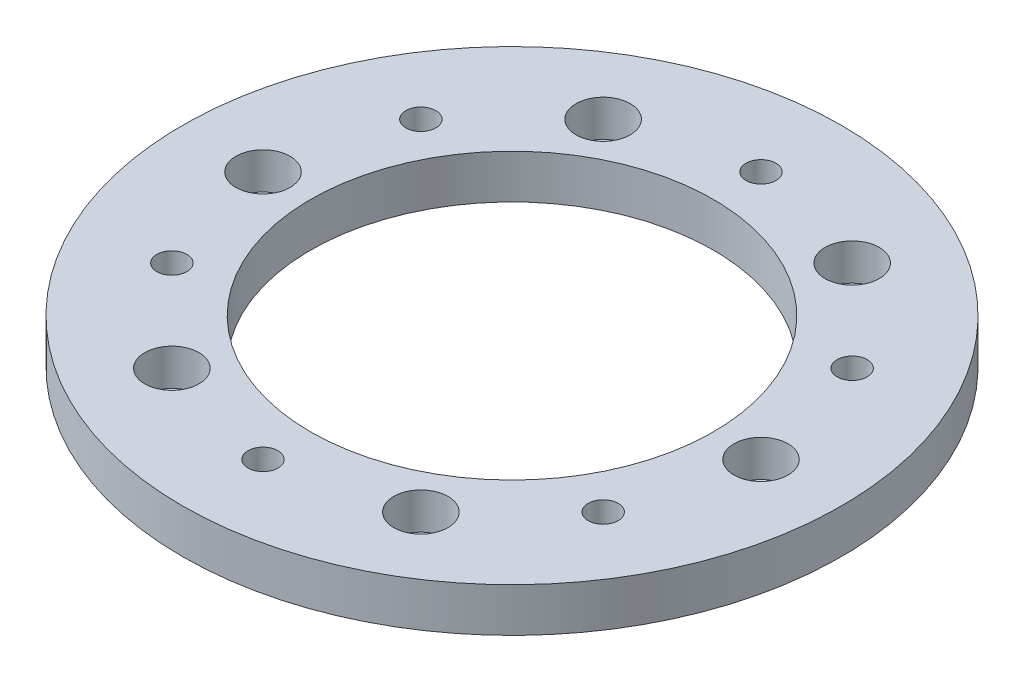
ISO-10303-21;
HEADER;
FILE_DESCRIPTION(('STEP AP214'),'2;1');
FILE_NAME('part.step','',(''),(''),'','','');
FILE_SCHEMA(('AUTOMOTIVE_DESIGN { 1 0 10303 214 1 1 1 1 }'));
ENDSEC;
DATA;
#1=APPLICATION_CONTEXT('core data for automotive mechanical design processes');
#2=APPLICATION_PROTOCOL_DEFINITION('international standard','automotive_design',2000,#1);
#3=PRODUCT_CONTEXT('',#1,'mechanical');
#4=PRODUCT('Part','Part','',(#3));
#5=PRODUCT_RELATED_PRODUCT_CATEGORY('part','',(#4));
#6=PRODUCT_DEFINITION_FORMATION('','',#4);
#7=PRODUCT_DEFINITION_CONTEXT('part definition',#1,'design');
#8=PRODUCT_DEFINITION('design','',#6,#7);
#9=PRODUCT_DEFINITION_SHAPE('','',#8);
#10=(LENGTH_UNIT() NAMED_UNIT(*) SI_UNIT(.MILLI.,.METRE.));
#11=(NAMED_UNIT(*) PLANE_ANGLE_UNIT() SI_UNIT($,.RADIAN.));
#12=(NAMED_UNIT(*) SI_UNIT($,.STERADIAN.) SOLID_ANGLE_UNIT());
#13=UNCERTAINTY_MEASURE_WITH_UNIT(LENGTH_MEASURE(1.E-05),#10,'distance_accuracy_value','');
#14=(GEOMETRIC_REPRESENTATION_CONTEXT(3) GLOBAL_UNCERTAINTY_ASSIGNED_CONTEXT((#13)) GLOBAL_UNIT_ASSIGNED_CONTEXT((#10,
#11,#12)) REPRESENTATION_CONTEXT('',''));
#15=CARTESIAN_POINT('',(0.,0.,0.));
#16=DIRECTION('',(0.,0.,1.));
#17=DIRECTION('',(1.,0.,0.));
#18=AXIS2_PLACEMENT_3D('',#15,#16,#17);
#19=CARTESIAN_POINT('',(34.,6.,0.));
#20=DIRECTION('',(0.,-1.,0.));
#21=DIRECTION('',(0.,0.,-1.));
#22=AXIS2_PLACEMENT_3D('',#19,#20,#21);
#23=CYLINDRICAL_SURFACE('',#22,2.04999999999999);
#24=CARTESIAN_POINT('',(34.,0.,0.));
#25=DIRECTION('',(0.,1.,0.));
#26=DIRECTION('',(0.,0.,1.));
#27=AXIS2_PLACEMENT_3D('',#24,#25,#26);
#28=CIRCLE('',#27,2.04999999999999);
#29=CARTESIAN_POINT('',(34.,0.,2.04999999999999));
#30=VERTEX_POINT('',#29);
#31=EDGE_CURVE('E54',#30,#30,#28,.T.);
#32=ORIENTED_EDGE('',*,*,#31,.F.);
#33=EDGE_LOOP('',(#32));
#34=FACE_BOUND('',#33,.T.);
#35=CARTESIAN_POINT('',(34.,1.,0.));
#36=DIRECTION('',(0.,1.,0.));
#37=DIRECTION('',(0.,0.,1.));
#38=AXIS2_PLACEMENT_3D('',#35,#36,#37);
#39=CIRCLE('',#38,2.04999999999999);
#40=CARTESIAN_POINT('',(34.,1.,2.04999999999999));
#41=VERTEX_POINT('',#40);
#42=EDGE_CURVE('E45',#41,#41,#39,.T.);
#43=ORIENTED_EDGE('',*,*,#42,.T.);
#44=EDGE_LOOP('',(#43));
#45=FACE_BOUND('',#44,.T.);
#46=ADVANCED_FACE('F41',(#34,#45),#23,.F.);
#47=CARTESIAN_POINT('',(17.,6.,29.4448637286709));
#48=DIRECTION('',(0.,-1.,0.));
#49=DIRECTION('',(0.,0.,-1.));
#50=AXIS2_PLACEMENT_3D('',#47,#48,#49);
#51=CYLINDRICAL_SURFACE('',#50,2.05);
#52=CARTESIAN_POINT('',(17.,0.,29.4448637286709));
#53=DIRECTION('',(0.,1.,0.));
#54=DIRECTION('',(0.,0.,1.));
#55=AXIS2_PLACEMENT_3D('',#52,#53,#54);
#56=CIRCLE('',#55,2.05);
#57=CARTESIAN_POINT('',(17.,0.,31.4948637286709));
#58=VERTEX_POINT('',#57);
#59=EDGE_CURVE('E122',#58,#58,#56,.T.);
#60=ORIENTED_EDGE('',*,*,#59,.F.);
#61=EDGE_LOOP('',(#60));
#62=FACE_BOUND('',#61,.T.);
#63=CARTESIAN_POINT('',(17.,1.,29.4448637286709));
#64=DIRECTION('',(0.,1.,0.));
#65=DIRECTION('',(0.,0.,1.));
#66=AXIS2_PLACEMENT_3D('',#63,#64,#65);
#67=CIRCLE('',#66,2.05);
#68=CARTESIAN_POINT('',(17.,1.,31.4948637286709));
#69=VERTEX_POINT('',#68);
#70=EDGE_CURVE('E71',#69,#69,#67,.T.);
#71=ORIENTED_EDGE('',*,*,#70,.T.);
#72=EDGE_LOOP('',(#71));
#73=FACE_BOUND('',#72,.T.);
#74=ADVANCED_FACE('F157',(#62,#73),#51,.F.);
#75=CARTESIAN_POINT('',(-17.,6.,29.4448637286709));
#76=DIRECTION('',(0.,-1.,0.));
#77=DIRECTION('',(0.,0.,-1.));
#78=AXIS2_PLACEMENT_3D('',#75,#76,#77);
#79=CYLINDRICAL_SURFACE('',#78,2.05);
#80=CARTESIAN_POINT('',(-17.,0.,29.4448637286709));
#81=DIRECTION('',(0.,1.,0.));
#82=DIRECTION('',(0.,0.,1.));
#83=AXIS2_PLACEMENT_3D('',#80,#81,#82);
#84=CIRCLE('',#83,2.05);
#85=CARTESIAN_POINT('',(-17.,0.,31.4948637286709));
#86=VERTEX_POINT('',#85);
#87=EDGE_CURVE('E113',#86,#86,#84,.T.);
#88=ORIENTED_EDGE('',*,*,#87,.F.);
#89=EDGE_LOOP('',(#88));
#90=FACE_BOUND('',#89,.T.);
#91=CARTESIAN_POINT('',(-17.,1.,29.4448637286709));
#92=DIRECTION('',(0.,1.,0.));
#93=DIRECTION('',(0.,0.,1.));
#94=AXIS2_PLACEMENT_3D('',#91,#92,#93);
#95=CIRCLE('',#94,2.05);
#96=CARTESIAN_POINT('',(-17.,1.,31.4948637286709));
#97=VERTEX_POINT('',#96);
#98=EDGE_CURVE('E69',#97,#97,#95,.T.);
#99=ORIENTED_EDGE('',*,*,#98,.T.);
#100=EDGE_LOOP('',(#99));
#101=FACE_BOUND('',#100,.T.);
#102=ADVANCED_FACE('F162',(#90,#101),#79,.F.);
#103=CARTESIAN_POINT('',(-34.,6.,0.));
#104=DIRECTION('',(0.,-1.,0.));
#105=DIRECTION('',(0.,0.,-1.));
#106=AXIS2_PLACEMENT_3D('',#103,#104,#105);
#107=CYLINDRICAL_SURFACE('',#106,2.04999999999999);
#108=CARTESIAN_POINT('',(-34.,0.,0.));
#109=DIRECTION('',(0.,1.,0.));
#110=DIRECTION('',(0.,0.,1.));
#111=AXIS2_PLACEMENT_3D('',#108,#109,#110);
#112=CIRCLE('',#111,2.04999999999999);
#113=CARTESIAN_POINT('',(-34.,0.,2.05));
#114=VERTEX_POINT('',#113);
#115=EDGE_CURVE('E104',#114,#114,#112,.T.);
#116=ORIENTED_EDGE('',*,*,#115,.F.);
#117=EDGE_LOOP('',(#116));
#118=FACE_BOUND('',#117,.T.);
#119=CARTESIAN_POINT('',(-34.,1.,0.));
#120=DIRECTION('',(0.,1.,0.));
#121=DIRECTION('',(0.,0.,1.));
#122=AXIS2_PLACEMENT_3D('',#119,#120,#121);
#123=CIRCLE('',#122,2.04999999999999);
#124=CARTESIAN_POINT('',(-34.,1.,2.05));
#125=VERTEX_POINT('',#124);
#126=EDGE_CURVE('E66',#125,#125,#123,.T.);
#127=ORIENTED_EDGE('',*,*,#126,.T.);
#128=EDGE_LOOP('',(#127));
#129=FACE_BOUND('',#128,.T.);
#130=ADVANCED_FACE('F276',(#118,#129),#107,.F.);
#131=CARTESIAN_POINT('',(-17.,6.,-29.4448637286709));
#132=DIRECTION('',(0.,-1.,0.));
#133=DIRECTION('',(0.,0.,-1.));
#134=AXIS2_PLACEMENT_3D('',#131,#132,#133);
#135=CYLINDRICAL_SURFACE('',#134,2.04999999999999);
#136=CARTESIAN_POINT('',(-17.,0.,-29.4448637286709));
#137=DIRECTION('',(0.,1.,0.));
#138=DIRECTION('',(0.,0.,1.));
#139=AXIS2_PLACEMENT_3D('',#136,#137,#138);
#140=CIRCLE('',#139,2.04999999999999);
#141=CARTESIAN_POINT('',(-17.,0.,-27.3948637286709));
#142=VERTEX_POINT('',#141);
#143=EDGE_CURVE('E95',#142,#142,#140,.T.);
#144=ORIENTED_EDGE('',*,*,#143,.F.);
#145=EDGE_LOOP('',(#144));
#146=FACE_BOUND('',#145,.T.);
#147=CARTESIAN_POINT('',(-17.,1.,-29.4448637286709));
#148=DIRECTION('',(0.,1.,0.));
#149=DIRECTION('',(0.,0.,1.));
#150=AXIS2_PLACEMENT_3D('',#147,#148,#149);
#151=CIRCLE('',#150,2.04999999999999);
#152=CARTESIAN_POINT('',(-17.,1.,-27.3948637286709));
#153=VERTEX_POINT('',#152);
#154=EDGE_CURVE('E62',#153,#153,#151,.T.);
#155=ORIENTED_EDGE('',*,*,#154,.T.);
#156=EDGE_LOOP('',(#155));
#157=FACE_BOUND('',#156,.T.);
#158=ADVANCED_FACE('F286',(#146,#157),#135,.F.);
#159=CARTESIAN_POINT('',(17.,6.,-29.4448637286709));
#160=DIRECTION('',(0.,-1.,0.));
#161=DIRECTION('',(0.,0.,-1.));
#162=AXIS2_PLACEMENT_3D('',#159,#160,#161);
#163=CYLINDRICAL_SURFACE('',#162,2.04999999999999);
#164=CARTESIAN_POINT('',(17.,0.,-29.4448637286709));
#165=DIRECTION('',(0.,1.,0.));
#166=DIRECTION('',(0.,0.,1.));
#167=AXIS2_PLACEMENT_3D('',#164,#165,#166);
#168=CIRCLE('',#167,2.04999999999999);
#169=CARTESIAN_POINT('',(17.,0.,-27.3948637286709));
#170=VERTEX_POINT('',#169);
#171=EDGE_CURVE('E85',#170,#170,#168,.T.);
#172=ORIENTED_EDGE('',*,*,#171,.F.);
#173=EDGE_LOOP('',(#172));
#174=FACE_BOUND('',#173,.T.);
#175=CARTESIAN_POINT('',(17.,1.,-29.4448637286709));
#176=DIRECTION('',(0.,1.,0.));
#177=DIRECTION('',(0.,0.,1.));
#178=AXIS2_PLACEMENT_3D('',#175,#176,#177);
#179=CIRCLE('',#178,2.04999999999999);
#180=CARTESIAN_POINT('',(17.,1.,-27.3948637286709));
#181=VERTEX_POINT('',#180);
#182=EDGE_CURVE('E59',#181,#181,#179,.T.);
#183=ORIENTED_EDGE('',*,*,#182,.T.);
#184=EDGE_LOOP('',(#183));
#185=FACE_BOUND('',#184,.T.);
#186=ADVANCED_FACE('F169',(#174,#185),#163,.F.);
#187=CARTESIAN_POINT('',(0.,6.,0.));
#188=DIRECTION('',(0.,1.,0.));
#189=DIRECTION('',(0.,0.,1.));
#190=AXIS2_PLACEMENT_3D('',#187,#188,#189);
#191=PLANE('',#190);
#192=CARTESIAN_POINT('',(34.,6.,0.));
#193=DIRECTION('',(0.,1.,0.));
#194=DIRECTION('',(0.,0.,1.));
#195=AXIS2_PLACEMENT_3D('',#192,#193,#194);
#196=CIRCLE('',#195,3.7);
#197=CARTESIAN_POINT('',(34.,6.,3.7));
#198=VERTEX_POINT('',#197);
#199=EDGE_CURVE('E456',#198,#198,#196,.T.);
#200=ORIENTED_EDGE('',*,*,#199,.F.);
#201=EDGE_LOOP('',(#200));
#202=FACE_BOUND('',#201,.T.);
#203=CARTESIAN_POINT('',(17.,6.,-29.4448637286709));
#204=DIRECTION('',(0.,1.,0.));
#205=DIRECTION('',(0.,0.,1.));
#206=AXIS2_PLACEMENT_3D('',#203,#204,#205);
#207=CIRCLE('',#206,3.7);
#208=CARTESIAN_POINT('',(17.,6.,-25.7448637286709));
#209=VERTEX_POINT('',#208);
#210=EDGE_CURVE('E462',#209,#209,#207,.T.);
#211=ORIENTED_EDGE('',*,*,#210,.F.);
#212=EDGE_LOOP('',(#211));
#213=FACE_BOUND('',#212,.T.);
#214=CARTESIAN_POINT('',(-17.,6.,-29.4448637286709));
#215=DIRECTION('',(0.,1.,0.));
#216=DIRECTION('',(0.,0.,1.));
#217=AXIS2_PLACEMENT_3D('',#214,#215,#216);
#218=CIRCLE('',#217,3.70000000000001);
#219=CARTESIAN_POINT('',(-17.,6.,-25.7448637286709));
#220=VERTEX_POINT('',#219);
#221=EDGE_CURVE('E486',#220,#220,#218,.T.);
#222=ORIENTED_EDGE('',*,*,#221,.F.);
#223=EDGE_LOOP('',(#222));
#224=FACE_BOUND('',#223,.T.);
#225=CARTESIAN_POINT('',(-34.,6.,0.));
#226=DIRECTION('',(0.,1.,0.));
#227=DIRECTION('',(0.,0.,1.));
#228=AXIS2_PLACEMENT_3D('',#225,#226,#227);
#229=CIRCLE('',#228,3.7);
#230=CARTESIAN_POINT('',(-34.,6.,3.70000000000001));
#231=VERTEX_POINT('',#230);
#232=EDGE_CURVE('E480',#231,#231,#229,.T.);
#233=ORIENTED_EDGE('',*,*,#232,.F.);
#234=EDGE_LOOP('',(#233));
#235=FACE_BOUND('',#234,.T.);
#236=CARTESIAN_POINT('',(-17.,6.,29.4448637286709));
#237=DIRECTION('',(0.,1.,0.));
#238=DIRECTION('',(0.,0.,1.));
#239=AXIS2_PLACEMENT_3D('',#236,#237,#238);
#240=CIRCLE('',#239,3.7);
#241=CARTESIAN_POINT('',(-17.,6.,33.1448637286709));
#242=VERTEX_POINT('',#241);
#243=EDGE_CURVE('E474',#242,#242,#240,.T.);
#244=ORIENTED_EDGE('',*,*,#243,.F.);
#245=EDGE_LOOP('',(#244));
#246=FACE_BOUND('',#245,.T.);
#247=CARTESIAN_POINT('',(17.,6.,29.4448637286709));
#248=DIRECTION('',(0.,1.,0.));
#249=DIRECTION('',(0.,0.,1.));
#250=AXIS2_PLACEMENT_3D('',#247,#248,#249);
#251=CIRCLE('',#250,3.70000000000001);
#252=CARTESIAN_POINT('',(17.,6.,33.1448637286709));
#253=VERTEX_POINT('',#252);
#254=EDGE_CURVE('E459',#253,#253,#251,.T.);
#255=ORIENTED_EDGE('',*,*,#254,.F.);
#256=EDGE_LOOP('',(#255));
#257=FACE_BOUND('',#256,.T.);
#258=CARTESIAN_POINT('',(0.,6.,0.));
#259=DIRECTION('',(0.,1.,0.));
#260=DIRECTION('',(0.,0.,1.));
#261=AXIS2_PLACEMENT_3D('',#258,#259,#260);
#262=CIRCLE('',#261,27.5);
#263=CARTESIAN_POINT('',(0.,6.,27.5));
#264=VERTEX_POINT('',#263);
#265=EDGE_CURVE('E134',#264,#264,#262,.T.);
#266=ORIENTED_EDGE('',*,*,#265,.F.);
#267=EDGE_LOOP('',(#266));
#268=FACE_BOUND('',#267,.T.);
#269=CARTESIAN_POINT('',(0.,6.,0.));
#270=DIRECTION('',(0.,1.,0.));
#271=DIRECTION('',(0.,0.,1.));
#272=AXIS2_PLACEMENT_3D('',#269,#270,#271);
#273=CIRCLE('',#272,45.);
#274=CARTESIAN_POINT('',(0.,6.,45.));
#275=VERTEX_POINT('',#274);
#276=EDGE_CURVE('E10',#275,#275,#273,.T.);
#277=ORIENTED_EDGE('',*,*,#276,.T.);
#278=EDGE_LOOP('',(#277));
#279=FACE_BOUND('',#278,.T.);
#280=CARTESIAN_POINT('',(29.4448637286709,6.,17.));
#281=DIRECTION('',(0.,1.,0.));
#282=DIRECTION('',(0.,0.,1.));
#283=AXIS2_PLACEMENT_3D('',#280,#281,#282);
#284=CIRCLE('',#283,2.04999999999999);
#285=CARTESIAN_POINT('',(29.4448637286709,6.,19.05));
#286=VERTEX_POINT('',#285);
#287=EDGE_CURVE('E128',#286,#286,#284,.T.);
#288=ORIENTED_EDGE('',*,*,#287,.F.);
#289=EDGE_LOOP('',(#288));
#290=FACE_BOUND('',#289,.T.);
#291=CARTESIAN_POINT('',(0.,6.,34.));
#292=DIRECTION('',(0.,1.,0.));
#293=DIRECTION('',(0.,0.,1.));
#294=AXIS2_PLACEMENT_3D('',#291,#292,#293);
#295=CIRCLE('',#294,2.04999999999999);
#296=CARTESIAN_POINT('',(0.,6.,36.05));
#297=VERTEX_POINT('',#296);
#298=EDGE_CURVE('E119',#297,#297,#295,.T.);
#299=ORIENTED_EDGE('',*,*,#298,.F.);
#300=EDGE_LOOP('',(#299));
#301=FACE_BOUND('',#300,.T.);
#302=CARTESIAN_POINT('',(-29.4448637286709,6.,17.));
#303=DIRECTION('',(0.,1.,0.));
#304=DIRECTION('',(0.,0.,1.));
#305=AXIS2_PLACEMENT_3D('',#302,#303,#304);
#306=CIRCLE('',#305,2.04999999999999);
#307=CARTESIAN_POINT('',(-29.4448637286709,6.,19.05));
#308=VERTEX_POINT('',#307);
#309=EDGE_CURVE('E110',#308,#308,#306,.T.);
#310=ORIENTED_EDGE('',*,*,#309,.F.);
#311=EDGE_LOOP('',(#310));
#312=FACE_BOUND('',#311,.T.);
#313=CARTESIAN_POINT('',(-29.4448637286709,6.,-17.));
#314=DIRECTION('',(0.,1.,0.));
#315=DIRECTION('',(0.,0.,1.));
#316=AXIS2_PLACEMENT_3D('',#313,#314,#315);
#317=CIRCLE('',#316,2.04999999999999);
#318=CARTESIAN_POINT('',(-29.4448637286709,6.,-14.95));
#319=VERTEX_POINT('',#318);
#320=EDGE_CURVE('E101',#319,#319,#317,.T.);
#321=ORIENTED_EDGE('',*,*,#320,.F.);
#322=EDGE_LOOP('',(#321));
#323=FACE_BOUND('',#322,.T.);
#324=CARTESIAN_POINT('',(0.,6.,-34.));
#325=DIRECTION('',(0.,1.,0.));
#326=DIRECTION('',(0.,0.,1.));
#327=AXIS2_PLACEMENT_3D('',#324,#325,#326);
#328=CIRCLE('',#327,2.04999999999999);
#329=CARTESIAN_POINT('',(0.,6.,-31.95));
#330=VERTEX_POINT('',#329);
#331=EDGE_CURVE('E92',#330,#330,#328,.T.);
#332=ORIENTED_EDGE('',*,*,#331,.F.);
#333=EDGE_LOOP('',(#332));
#334=FACE_BOUND('',#333,.T.);
#335=CARTESIAN_POINT('',(29.4448637286709,6.,-17.));
#336=DIRECTION('',(0.,1.,0.));
#337=DIRECTION('',(0.,0.,1.));
#338=AXIS2_PLACEMENT_3D('',#335,#336,#337);
#339=CIRCLE('',#338,2.05);
#340=CARTESIAN_POINT('',(29.4448637286709,6.,-14.95));
#341=VERTEX_POINT('',#340);
#342=EDGE_CURVE('E80',#341,#341,#339,.T.);
#343=ORIENTED_EDGE('',*,*,#342,.F.);
#344=EDGE_LOOP('',(#343));
#345=FACE_BOUND('',#344,.T.);
#346=ADVANCED_FACE('F167',(#202,#213,#224,#235,#246,#257,#268,#279,#290,#301,#312,#323,#334,
#345),#191,.T.);
#347=CARTESIAN_POINT('',(0.,0.,0.));
#348=DIRECTION('',(0.,1.,0.));
#349=DIRECTION('',(0.,0.,1.));
#350=AXIS2_PLACEMENT_3D('',#347,#348,#349);
#351=PLANE('',#350);
#352=CARTESIAN_POINT('',(0.,0.,0.));
#353=DIRECTION('',(0.,1.,0.));
#354=DIRECTION('',(0.,0.,1.));
#355=AXIS2_PLACEMENT_3D('',#352,#353,#354);
#356=CIRCLE('',#355,45.);
#357=CARTESIAN_POINT('',(0.,0.,45.));
#358=VERTEX_POINT('',#357);
#359=EDGE_CURVE('E49',#358,#358,#356,.T.);
#360=ORIENTED_EDGE('',*,*,#359,.F.);
#361=EDGE_LOOP('',(#360));
#362=FACE_BOUND('',#361,.T.);
#363=ORIENTED_EDGE('',*,*,#31,.T.);
#364=EDGE_LOOP('',(#363));
#365=FACE_BOUND('',#364,.T.);
#366=CARTESIAN_POINT('',(0.,0.,0.));
#367=DIRECTION('',(0.,1.,0.));
#368=DIRECTION('',(0.,0.,1.));
#369=AXIS2_PLACEMENT_3D('',#366,#367,#368);
#370=CIRCLE('',#369,27.5);
#371=CARTESIAN_POINT('',(0.,0.,27.5));
#372=VERTEX_POINT('',#371);
#373=EDGE_CURVE('E131',#372,#372,#370,.T.);
#374=ORIENTED_EDGE('',*,*,#373,.T.);
#375=EDGE_LOOP('',(#374));
#376=FACE_BOUND('',#375,.T.);
#377=CARTESIAN_POINT('',(29.4448637286709,0.,17.));
#378=DIRECTION('',(0.,1.,0.));
#379=DIRECTION('',(0.,0.,1.));
#380=AXIS2_PLACEMENT_3D('',#377,#378,#379);
#381=CIRCLE('',#380,2.04999999999999);
#382=CARTESIAN_POINT('',(29.4448637286709,0.,19.05));
#383=VERTEX_POINT('',#382);
#384=EDGE_CURVE('E127',#383,#383,#381,.T.);
#385=ORIENTED_EDGE('',*,*,#384,.T.);
#386=EDGE_LOOP('',(#385));
#387=FACE_BOUND('',#386,.T.);
#388=ORIENTED_EDGE('',*,*,#59,.T.);
#389=EDGE_LOOP('',(#388));
#390=FACE_BOUND('',#389,.T.);
#391=CARTESIAN_POINT('',(0.,0.,34.));
#392=DIRECTION('',(0.,1.,0.));
#393=DIRECTION('',(0.,0.,1.));
#394=AXIS2_PLACEMENT_3D('',#391,#392,#393);
#395=CIRCLE('',#394,2.04999999999999);
#396=CARTESIAN_POINT('',(0.,0.,36.05));
#397=VERTEX_POINT('',#396);
#398=EDGE_CURVE('E118',#397,#397,#395,.T.);
#399=ORIENTED_EDGE('',*,*,#398,.T.);
#400=EDGE_LOOP('',(#399));
#401=FACE_BOUND('',#400,.T.);
#402=ORIENTED_EDGE('',*,*,#87,.T.);
#403=EDGE_LOOP('',(#402));
#404=FACE_BOUND('',#403,.T.);
#405=CARTESIAN_POINT('',(-29.4448637286709,0.,17.));
#406=DIRECTION('',(0.,1.,0.));
#407=DIRECTION('',(0.,0.,1.));
#408=AXIS2_PLACEMENT_3D('',#405,#406,#407);
#409=CIRCLE('',#408,2.04999999999999);
#410=CARTESIAN_POINT('',(-29.4448637286709,0.,19.05));
#411=VERTEX_POINT('',#410);
#412=EDGE_CURVE('E109',#411,#411,#409,.T.);
#413=ORIENTED_EDGE('',*,*,#412,.T.);
#414=EDGE_LOOP('',(#413));
#415=FACE_BOUND('',#414,.T.);
#416=ORIENTED_EDGE('',*,*,#115,.T.);
#417=EDGE_LOOP('',(#416));
#418=FACE_BOUND('',#417,.T.);
#419=CARTESIAN_POINT('',(-29.4448637286709,0.,-17.));
#420=DIRECTION('',(0.,1.,0.));
#421=DIRECTION('',(0.,0.,1.));
#422=AXIS2_PLACEMENT_3D('',#419,#420,#421);
#423=CIRCLE('',#422,2.04999999999999);
#424=CARTESIAN_POINT('',(-29.4448637286709,0.,-14.95));
#425=VERTEX_POINT('',#424);
#426=EDGE_CURVE('E100',#425,#425,#423,.T.);
#427=ORIENTED_EDGE('',*,*,#426,.T.);
#428=EDGE_LOOP('',(#427));
#429=FACE_BOUND('',#428,.T.);
#430=ORIENTED_EDGE('',*,*,#143,.T.);
#431=EDGE_LOOP('',(#430));
#432=FACE_BOUND('',#431,.T.);
#433=CARTESIAN_POINT('',(0.,0.,-34.));
#434=DIRECTION('',(0.,1.,0.));
#435=DIRECTION('',(0.,0.,1.));
#436=AXIS2_PLACEMENT_3D('',#433,#434,#435);
#437=CIRCLE('',#436,2.04999999999999);
#438=CARTESIAN_POINT('',(0.,0.,-31.95));
#439=VERTEX_POINT('',#438);
#440=EDGE_CURVE('E91',#439,#439,#437,.T.);
#441=ORIENTED_EDGE('',*,*,#440,.T.);
#442=EDGE_LOOP('',(#441));
#443=FACE_BOUND('',#442,.T.);
#444=ORIENTED_EDGE('',*,*,#171,.T.);
#445=EDGE_LOOP('',(#444));
#446=FACE_BOUND('',#445,.T.);
#447=CARTESIAN_POINT('',(29.4448637286709,0.,-17.));
#448=DIRECTION('',(0.,1.,0.));
#449=DIRECTION('',(0.,0.,1.));
#450=AXIS2_PLACEMENT_3D('',#447,#448,#449);
#451=CIRCLE('',#450,2.05);
#452=CARTESIAN_POINT('',(29.4448637286709,0.,-14.95));
#453=VERTEX_POINT('',#452);
#454=EDGE_CURVE('E76',#453,#453,#451,.T.);
#455=ORIENTED_EDGE('',*,*,#454,.T.);
#456=EDGE_LOOP('',(#455));
#457=FACE_BOUND('',#456,.T.);
#458=ADVANCED_FACE('F139',(#362,#365,#376,#387,#390,#401,#404,#415,#418,#429,#432,#443,#446,
#457),#351,.F.);
#459=CARTESIAN_POINT('',(0.,6.,0.));
#460=DIRECTION('',(0.,-1.,0.));
#461=DIRECTION('',(0.,0.,-1.));
#462=AXIS2_PLACEMENT_3D('',#459,#460,#461);
#463=CYLINDRICAL_SURFACE('',#462,45.);
#464=ORIENTED_EDGE('',*,*,#276,.F.);
#465=EDGE_LOOP('',(#464));
#466=FACE_BOUND('',#465,.T.);
#467=ORIENTED_EDGE('',*,*,#359,.T.);
#468=EDGE_LOOP('',(#467));
#469=FACE_BOUND('',#468,.T.);
#470=ADVANCED_FACE('F43',(#466,#469),#463,.T.);
#471=CARTESIAN_POINT('',(0.,6.,0.));
#472=DIRECTION('',(0.,-1.,0.));
#473=DIRECTION('',(0.,0.,-1.));
#474=AXIS2_PLACEMENT_3D('',#471,#472,#473);
#475=CYLINDRICAL_SURFACE('',#474,27.5);
#476=ORIENTED_EDGE('',*,*,#265,.T.);
#477=EDGE_LOOP('',(#476));
#478=FACE_BOUND('',#477,.T.);
#479=ORIENTED_EDGE('',*,*,#373,.F.);
#480=EDGE_LOOP('',(#479));
#481=FACE_BOUND('',#480,.T.);
#482=ADVANCED_FACE('F142',(#478,#481),#475,.F.);
#483=CARTESIAN_POINT('',(29.4448637286709,6.,17.));
#484=DIRECTION('',(0.,-1.,0.));
#485=DIRECTION('',(0.,0.,-1.));
#486=AXIS2_PLACEMENT_3D('',#483,#484,#485);
#487=CYLINDRICAL_SURFACE('',#486,2.04999999999999);
#488=ORIENTED_EDGE('',*,*,#287,.T.);
#489=EDGE_LOOP('',(#488));
#490=FACE_BOUND('',#489,.T.);
#491=ORIENTED_EDGE('',*,*,#384,.F.);
#492=EDGE_LOOP('',(#491));
#493=FACE_BOUND('',#492,.T.);
#494=ADVANCED_FACE('F144',(#490,#493),#487,.F.);
#495=CARTESIAN_POINT('',(0.,6.,34.));
#496=DIRECTION('',(0.,-1.,0.));
#497=DIRECTION('',(0.,0.,-1.));
#498=AXIS2_PLACEMENT_3D('',#495,#496,#497);
#499=CYLINDRICAL_SURFACE('',#498,2.04999999999999);
#500=ORIENTED_EDGE('',*,*,#298,.T.);
#501=EDGE_LOOP('',(#500));
#502=FACE_BOUND('',#501,.T.);
#503=ORIENTED_EDGE('',*,*,#398,.F.);
#504=EDGE_LOOP('',(#503));
#505=FACE_BOUND('',#504,.T.);
#506=ADVANCED_FACE('F151',(#502,#505),#499,.F.);
#507=CARTESIAN_POINT('',(-29.4448637286709,6.,17.));
#508=DIRECTION('',(0.,-1.,0.));
#509=DIRECTION('',(0.,0.,-1.));
#510=AXIS2_PLACEMENT_3D('',#507,#508,#509);
#511=CYLINDRICAL_SURFACE('',#510,2.04999999999999);
#512=ORIENTED_EDGE('',*,*,#309,.T.);
#513=EDGE_LOOP('',(#512));
#514=FACE_BOUND('',#513,.T.);
#515=ORIENTED_EDGE('',*,*,#412,.F.);
#516=EDGE_LOOP('',(#515));
#517=FACE_BOUND('',#516,.T.);
#518=ADVANCED_FACE('F208',(#514,#517),#511,.F.);
#519=CARTESIAN_POINT('',(-29.4448637286709,6.,-17.));
#520=DIRECTION('',(0.,-1.,0.));
#521=DIRECTION('',(0.,0.,-1.));
#522=AXIS2_PLACEMENT_3D('',#519,#520,#521);
#523=CYLINDRICAL_SURFACE('',#522,2.04999999999999);
#524=ORIENTED_EDGE('',*,*,#320,.T.);
#525=EDGE_LOOP('',(#524));
#526=FACE_BOUND('',#525,.T.);
#527=ORIENTED_EDGE('',*,*,#426,.F.);
#528=EDGE_LOOP('',(#527));
#529=FACE_BOUND('',#528,.T.);
#530=ADVANCED_FACE('F219',(#526,#529),#523,.F.);
#531=CARTESIAN_POINT('',(0.,6.,-34.));
#532=DIRECTION('',(0.,-1.,0.));
#533=DIRECTION('',(0.,0.,-1.));
#534=AXIS2_PLACEMENT_3D('',#531,#532,#533);
#535=CYLINDRICAL_SURFACE('',#534,2.04999999999999);
#536=ORIENTED_EDGE('',*,*,#331,.T.);
#537=EDGE_LOOP('',(#536));
#538=FACE_BOUND('',#537,.T.);
#539=ORIENTED_EDGE('',*,*,#440,.F.);
#540=EDGE_LOOP('',(#539));
#541=FACE_BOUND('',#540,.T.);
#542=ADVANCED_FACE('F230',(#538,#541),#535,.F.);
#543=CARTESIAN_POINT('',(29.4448637286709,6.,-17.));
#544=DIRECTION('',(0.,-1.,0.));
#545=DIRECTION('',(0.,0.,-1.));
#546=AXIS2_PLACEMENT_3D('',#543,#544,#545);
#547=CYLINDRICAL_SURFACE('',#546,2.05);
#548=ORIENTED_EDGE('',*,*,#342,.T.);
#549=EDGE_LOOP('',(#548));
#550=FACE_BOUND('',#549,.T.);
#551=ORIENTED_EDGE('',*,*,#454,.F.);
#552=EDGE_LOOP('',(#551));
#553=FACE_BOUND('',#552,.T.);
#554=ADVANCED_FACE('F241',(#550,#553),#547,.F.);
#555=CARTESIAN_POINT('',(17.,1.,-29.4448637286709));
#556=DIRECTION('',(0.,1.,0.));
#557=DIRECTION('',(0.,0.,1.));
#558=AXIS2_PLACEMENT_3D('',#555,#556,#557);
#559=CYLINDRICAL_SURFACE('',#558,3.7);
#560=CARTESIAN_POINT('',(17.,1.,-29.4448637286709));
#561=DIRECTION('',(0.,1.,0.));
#562=DIRECTION('',(0.,0.,1.));
#563=AXIS2_PLACEMENT_3D('',#560,#561,#562);
#564=CIRCLE('',#563,3.7);
#565=CARTESIAN_POINT('',(17.,1.,-25.7448637286709));
#566=VERTEX_POINT('',#565);
#567=EDGE_CURVE('E466',#566,#566,#564,.T.);
#568=ORIENTED_EDGE('',*,*,#567,.F.);
#569=EDGE_LOOP('',(#568));
#570=FACE_BOUND('',#569,.T.);
#571=ORIENTED_EDGE('',*,*,#210,.T.);
#572=EDGE_LOOP('',(#571));
#573=FACE_BOUND('',#572,.T.);
#574=ADVANCED_FACE('F251',(#570,#573),#559,.F.);
#575=CARTESIAN_POINT('',(17.,1.,-29.4448637286709));
#576=DIRECTION('',(0.,1.,0.));
#577=DIRECTION('',(0.,0.,1.));
#578=AXIS2_PLACEMENT_3D('',#575,#576,#577);
#579=PLANE('',#578);
#580=ORIENTED_EDGE('',*,*,#182,.F.);
#581=EDGE_LOOP('',(#580));
#582=FACE_BOUND('',#581,.T.);
#583=ORIENTED_EDGE('',*,*,#567,.T.);
#584=EDGE_LOOP('',(#583));
#585=FACE_BOUND('',#584,.T.);
#586=ADVANCED_FACE('F316',(#582,#585),#579,.T.);
#587=CARTESIAN_POINT('',(-17.,1.,-29.4448637286709));
#588=DIRECTION('',(0.,1.,0.));
#589=DIRECTION('',(0.,0.,1.));
#590=AXIS2_PLACEMENT_3D('',#587,#588,#589);
#591=CYLINDRICAL_SURFACE('',#590,3.70000000000001);
#592=CARTESIAN_POINT('',(-17.,1.,-29.4448637286709));
#593=DIRECTION('',(0.,1.,0.));
#594=DIRECTION('',(0.,0.,1.));
#595=AXIS2_PLACEMENT_3D('',#592,#593,#594);
#596=CIRCLE('',#595,3.70000000000001);
#597=CARTESIAN_POINT('',(-17.,1.,-25.7448637286709));
#598=VERTEX_POINT('',#597);
#599=EDGE_CURVE('E465',#598,#598,#596,.T.);
#600=ORIENTED_EDGE('',*,*,#599,.F.);
#601=EDGE_LOOP('',(#600));
#602=FACE_BOUND('',#601,.T.);
#603=ORIENTED_EDGE('',*,*,#221,.T.);
#604=EDGE_LOOP('',(#603));
#605=FACE_BOUND('',#604,.T.);
#606=ADVANCED_FACE('F326',(#602,#605),#591,.F.);
#607=CARTESIAN_POINT('',(-17.,1.,-29.4448637286709));
#608=DIRECTION('',(0.,1.,0.));
#609=DIRECTION('',(0.,0.,1.));
#610=AXIS2_PLACEMENT_3D('',#607,#608,#609);
#611=PLANE('',#610);
#612=ORIENTED_EDGE('',*,*,#154,.F.);
#613=EDGE_LOOP('',(#612));
#614=FACE_BOUND('',#613,.T.);
#615=ORIENTED_EDGE('',*,*,#599,.T.);
#616=EDGE_LOOP('',(#615));
#617=FACE_BOUND('',#616,.T.);
#618=ADVANCED_FACE('F337',(#614,#617),#611,.T.);
#619=CARTESIAN_POINT('',(-34.,1.,0.));
#620=DIRECTION('',(0.,1.,0.));
#621=DIRECTION('',(0.,0.,1.));
#622=AXIS2_PLACEMENT_3D('',#619,#620,#621);
#623=CYLINDRICAL_SURFACE('',#622,3.7);
#624=CARTESIAN_POINT('',(-34.,1.,0.));
#625=DIRECTION('',(0.,1.,0.));
#626=DIRECTION('',(0.,0.,1.));
#627=AXIS2_PLACEMENT_3D('',#624,#625,#626);
#628=CIRCLE('',#627,3.7);
#629=CARTESIAN_POINT('',(-34.,1.,3.70000000000001));
#630=VERTEX_POINT('',#629);
#631=EDGE_CURVE('E483',#630,#630,#628,.T.);
#632=ORIENTED_EDGE('',*,*,#631,.F.);
#633=EDGE_LOOP('',(#632));
#634=FACE_BOUND('',#633,.T.);
#635=ORIENTED_EDGE('',*,*,#232,.T.);
#636=EDGE_LOOP('',(#635));
#637=FACE_BOUND('',#636,.T.);
#638=ADVANCED_FACE('F348',(#634,#637),#623,.F.);
#639=CARTESIAN_POINT('',(-34.,1.,0.));
#640=DIRECTION('',(0.,1.,0.));
#641=DIRECTION('',(0.,0.,1.));
#642=AXIS2_PLACEMENT_3D('',#639,#640,#641);
#643=PLANE('',#642);
#644=ORIENTED_EDGE('',*,*,#126,.F.);
#645=EDGE_LOOP('',(#644));
#646=FACE_BOUND('',#645,.T.);
#647=ORIENTED_EDGE('',*,*,#631,.T.);
#648=EDGE_LOOP('',(#647));
#649=FACE_BOUND('',#648,.T.);
#650=ADVANCED_FACE('F359',(#646,#649),#643,.T.);
#651=CARTESIAN_POINT('',(-17.,1.,29.4448637286709));
#652=DIRECTION('',(0.,1.,0.));
#653=DIRECTION('',(0.,0.,1.));
#654=AXIS2_PLACEMENT_3D('',#651,#652,#653);
#655=CYLINDRICAL_SURFACE('',#654,3.7);
#656=CARTESIAN_POINT('',(-17.,1.,29.4448637286709));
#657=DIRECTION('',(0.,1.,0.));
#658=DIRECTION('',(0.,0.,1.));
#659=AXIS2_PLACEMENT_3D('',#656,#657,#658);
#660=CIRCLE('',#659,3.7);
#661=CARTESIAN_POINT('',(-17.,1.,33.1448637286709));
#662=VERTEX_POINT('',#661);
#663=EDGE_CURVE('E477',#662,#662,#660,.T.);
#664=ORIENTED_EDGE('',*,*,#663,.F.);
#665=EDGE_LOOP('',(#664));
#666=FACE_BOUND('',#665,.T.);
#667=ORIENTED_EDGE('',*,*,#243,.T.);
#668=EDGE_LOOP('',(#667));
#669=FACE_BOUND('',#668,.T.);
#670=ADVANCED_FACE('F370',(#666,#669),#655,.F.);
#671=CARTESIAN_POINT('',(-17.,1.,29.4448637286709));
#672=DIRECTION('',(0.,1.,0.));
#673=DIRECTION('',(0.,0.,1.));
#674=AXIS2_PLACEMENT_3D('',#671,#672,#673);
#675=PLANE('',#674);
#676=ORIENTED_EDGE('',*,*,#98,.F.);
#677=EDGE_LOOP('',(#676));
#678=FACE_BOUND('',#677,.T.);
#679=ORIENTED_EDGE('',*,*,#663,.T.);
#680=EDGE_LOOP('',(#679));
#681=FACE_BOUND('',#680,.T.);
#682=ADVANCED_FACE('F381',(#678,#681),#675,.T.);
#683=CARTESIAN_POINT('',(17.,1.,29.4448637286709));
#684=DIRECTION('',(0.,1.,0.));
#685=DIRECTION('',(0.,0.,1.));
#686=AXIS2_PLACEMENT_3D('',#683,#684,#685);
#687=CYLINDRICAL_SURFACE('',#686,3.70000000000001);
#688=CARTESIAN_POINT('',(17.,1.,29.4448637286709));
#689=DIRECTION('',(0.,1.,0.));
#690=DIRECTION('',(0.,0.,1.));
#691=AXIS2_PLACEMENT_3D('',#688,#689,#690);
#692=CIRCLE('',#691,3.70000000000001);
#693=CARTESIAN_POINT('',(17.,1.,33.1448637286709));
#694=VERTEX_POINT('',#693);
#695=EDGE_CURVE('E471',#694,#694,#692,.T.);
#696=ORIENTED_EDGE('',*,*,#695,.F.);
#697=EDGE_LOOP('',(#696));
#698=FACE_BOUND('',#697,.T.);
#699=ORIENTED_EDGE('',*,*,#254,.T.);
#700=EDGE_LOOP('',(#699));
#701=FACE_BOUND('',#700,.T.);
#702=ADVANCED_FACE('F392',(#698,#701),#687,.F.);
#703=CARTESIAN_POINT('',(17.,1.,29.4448637286709));
#704=DIRECTION('',(0.,1.,0.));
#705=DIRECTION('',(0.,0.,1.));
#706=AXIS2_PLACEMENT_3D('',#703,#704,#705);
#707=PLANE('',#706);
#708=ORIENTED_EDGE('',*,*,#70,.F.);
#709=EDGE_LOOP('',(#708));
#710=FACE_BOUND('',#709,.T.);
#711=ORIENTED_EDGE('',*,*,#695,.T.);
#712=EDGE_LOOP('',(#711));
#713=FACE_BOUND('',#712,.T.);
#714=ADVANCED_FACE('F403',(#710,#713),#707,.T.);
#715=CARTESIAN_POINT('',(34.,1.,0.));
#716=DIRECTION('',(0.,1.,0.));
#717=DIRECTION('',(0.,0.,1.));
#718=AXIS2_PLACEMENT_3D('',#715,#716,#717);
#719=CYLINDRICAL_SURFACE('',#718,3.7);
#720=CARTESIAN_POINT('',(34.,1.,0.));
#721=DIRECTION('',(0.,1.,0.));
#722=DIRECTION('',(0.,0.,1.));
#723=AXIS2_PLACEMENT_3D('',#720,#721,#722);
#724=CIRCLE('',#723,3.7);
#725=CARTESIAN_POINT('',(34.,1.,3.7));
#726=VERTEX_POINT('',#725);
#727=EDGE_CURVE('E63',#726,#726,#724,.T.);
#728=ORIENTED_EDGE('',*,*,#727,.F.);
#729=EDGE_LOOP('',(#728));
#730=FACE_BOUND('',#729,.T.);
#731=ORIENTED_EDGE('',*,*,#199,.T.);
#732=EDGE_LOOP('',(#731));
#733=FACE_BOUND('',#732,.T.);
#734=ADVANCED_FACE('F414',(#730,#733),#719,.F.);
#735=CARTESIAN_POINT('',(34.,1.,0.));
#736=DIRECTION('',(0.,1.,0.));
#737=DIRECTION('',(0.,0.,1.));
#738=AXIS2_PLACEMENT_3D('',#735,#736,#737);
#739=PLANE('',#738);
#740=ORIENTED_EDGE('',*,*,#42,.F.);
#741=EDGE_LOOP('',(#740));
#742=FACE_BOUND('',#741,.T.);
#743=ORIENTED_EDGE('',*,*,#727,.T.);
#744=EDGE_LOOP('',(#743));
#745=FACE_BOUND('',#744,.T.);
#746=ADVANCED_FACE('F425',(#742,#745),#739,.T.);
#747=CLOSED_SHELL('',(#46,#74,#102,#130,#158,#186,#346,#458,#470,#482,#494,#506,#518,#530,#542,
#554,#574,#586,#606,#618,#638,#650,#670,#682,#702,#714,#734,#746));
#748=MANIFOLD_SOLID_BREP('B2',#747);
#749=ADVANCED_BREP_SHAPE_REPRESENTATION('',(#18,#748),#14);
#750=SHAPE_DEFINITION_REPRESENTATION(#9,#749);
ENDSEC;
END-ISO-10303-21;
